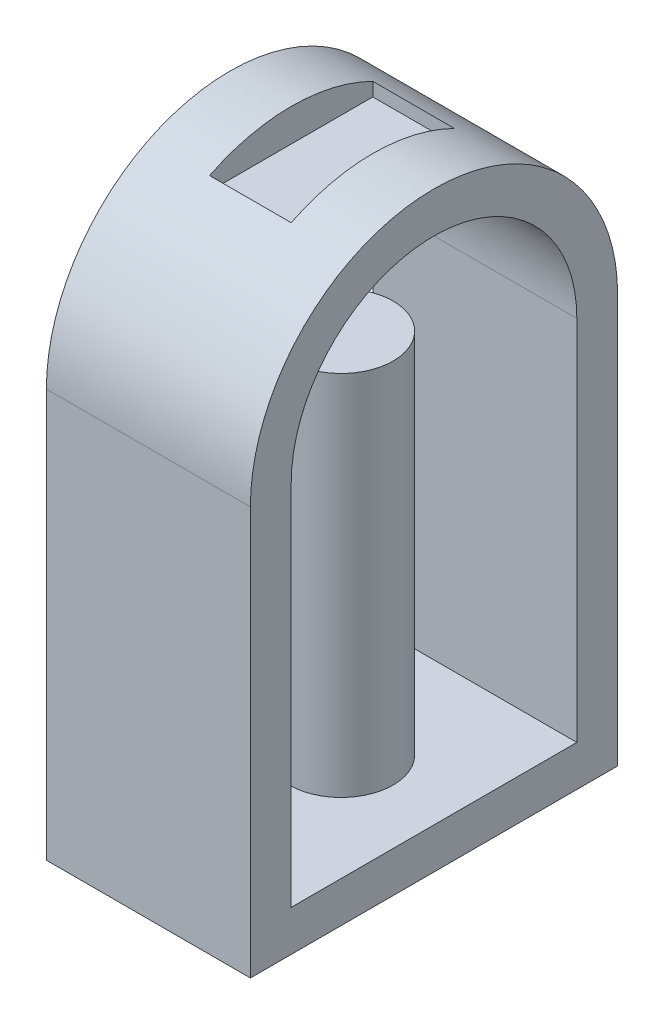
ISO-10303-21;
HEADER;
FILE_DESCRIPTION(('STEP AP214'),'2;1');
FILE_NAME('part.step','',(''),(''),'','','');
FILE_SCHEMA(('AUTOMOTIVE_DESIGN { 1 0 10303 214 1 1 1 1 }'));
ENDSEC;
DATA;
#1=APPLICATION_CONTEXT('core data for automotive mechanical design processes');
#2=APPLICATION_PROTOCOL_DEFINITION('international standard','automotive_design',2000,#1);
#3=PRODUCT_CONTEXT('',#1,'mechanical');
#4=PRODUCT('Part','Part','',(#3));
#5=PRODUCT_RELATED_PRODUCT_CATEGORY('part','',(#4));
#6=PRODUCT_DEFINITION_FORMATION('','',#4);
#7=PRODUCT_DEFINITION_CONTEXT('part definition',#1,'design');
#8=PRODUCT_DEFINITION('design','',#6,#7);
#9=PRODUCT_DEFINITION_SHAPE('','',#8);
#10=(LENGTH_UNIT() NAMED_UNIT(*) SI_UNIT(.MILLI.,.METRE.));
#11=(NAMED_UNIT(*) PLANE_ANGLE_UNIT() SI_UNIT($,.RADIAN.));
#12=(NAMED_UNIT(*) SI_UNIT($,.STERADIAN.) SOLID_ANGLE_UNIT());
#13=UNCERTAINTY_MEASURE_WITH_UNIT(LENGTH_MEASURE(1.E-05),#10,'distance_accuracy_value','');
#14=(GEOMETRIC_REPRESENTATION_CONTEXT(3) GLOBAL_UNCERTAINTY_ASSIGNED_CONTEXT((#13)) GLOBAL_UNIT_ASSIGNED_CONTEXT((#10,
#11,#12)) REPRESENTATION_CONTEXT('',''));
#15=CARTESIAN_POINT('',(0.,0.,0.));
#16=DIRECTION('',(0.,0.,1.));
#17=DIRECTION('',(1.,0.,0.));
#18=AXIS2_PLACEMENT_3D('',#15,#16,#17);
#19=CARTESIAN_POINT('',(127.,228.6,-88.8999999999999));
#20=DIRECTION('',(-1.,0.,0.));
#21=DIRECTION('',(0.,0.,1.));
#22=AXIS2_PLACEMENT_3D('',#19,#20,#21);
#23=PLANE('',#22);
#24=DIRECTION('',(0.,0.,-1.));
#25=VECTOR('',#24,1.);
#26=CARTESIAN_POINT('',(127.,-25.4,25.4));
#27=LINE('',#26,#25);
#28=CARTESIAN_POINT('',(127.,-25.4,25.4));
#29=VERTEX_POINT('',#28);
#30=CARTESIAN_POINT('',(127.,-25.4,-203.2));
#31=VERTEX_POINT('',#30);
#32=EDGE_CURVE('E198',#29,#31,#27,.T.);
#33=ORIENTED_EDGE('',*,*,#32,.T.);
#34=DIRECTION('',(0.,1.,0.));
#35=VECTOR('',#34,1.);
#36=CARTESIAN_POINT('',(127.,-25.4,-203.2));
#37=LINE('',#36,#35);
#38=CARTESIAN_POINT('',(127.,228.6,-203.2));
#39=VERTEX_POINT('',#38);
#40=EDGE_CURVE('E201',#31,#39,#37,.T.);
#41=ORIENTED_EDGE('',*,*,#40,.T.);
#42=CARTESIAN_POINT('',(127.,228.6,-88.8999999999999));
#43=DIRECTION('',(1.,0.,0.));
#44=DIRECTION('',(0.,0.,1.));
#45=AXIS2_PLACEMENT_3D('',#42,#43,#44);
#46=CIRCLE('',#45,114.3);
#47=CARTESIAN_POINT('',(127.,228.6,25.4));
#48=VERTEX_POINT('',#47);
#49=EDGE_CURVE('E204',#39,#48,#46,.T.);
#50=ORIENTED_EDGE('',*,*,#49,.T.);
#51=DIRECTION('',(0.,-1.,0.));
#52=VECTOR('',#51,1.);
#53=CARTESIAN_POINT('',(127.,-25.4,25.4));
#54=LINE('',#53,#52);
#55=EDGE_CURVE('E206',#48,#29,#54,.T.);
#56=ORIENTED_EDGE('',*,*,#55,.T.);
#57=EDGE_LOOP('',(#33,#41,#50,#56));
#58=FACE_BOUND('',#57,.T.);
#59=DIRECTION('',(0.,-1.,0.));
#60=VECTOR('',#59,1.);
#61=CARTESIAN_POINT('',(127.,0.,0.));
#62=LINE('',#61,#60);
#63=CARTESIAN_POINT('',(127.,228.6,0.));
#64=VERTEX_POINT('',#63);
#65=CARTESIAN_POINT('',(127.,0.,0.));
#66=VERTEX_POINT('',#65);
#67=EDGE_CURVE('E169',#64,#66,#62,.T.);
#68=ORIENTED_EDGE('',*,*,#67,.F.);
#69=CARTESIAN_POINT('',(127.,228.6,-88.8999999999999));
#70=DIRECTION('',(1.,0.,0.));
#71=DIRECTION('',(0.,0.,1.));
#72=AXIS2_PLACEMENT_3D('',#69,#70,#71);
#73=CIRCLE('',#72,88.9);
#74=CARTESIAN_POINT('',(127.,228.6,-177.8));
#75=VERTEX_POINT('',#74);
#76=EDGE_CURVE('E176',#75,#64,#73,.T.);
#77=ORIENTED_EDGE('',*,*,#76,.F.);
#78=DIRECTION('',(0.,1.,0.));
#79=VECTOR('',#78,1.);
#80=CARTESIAN_POINT('',(127.,0.,-177.8));
#81=LINE('',#80,#79);
#82=CARTESIAN_POINT('',(127.,0.,-177.8));
#83=VERTEX_POINT('',#82);
#84=EDGE_CURVE('E174',#83,#75,#81,.T.);
#85=ORIENTED_EDGE('',*,*,#84,.F.);
#86=DIRECTION('',(0.,0.,-1.));
#87=VECTOR('',#86,1.);
#88=CARTESIAN_POINT('',(127.,0.,0.));
#89=LINE('',#88,#87);
#90=EDGE_CURVE('E171',#66,#83,#89,.T.);
#91=ORIENTED_EDGE('',*,*,#90,.F.);
#92=EDGE_LOOP('',(#68,#77,#85,#91));
#93=FACE_BOUND('',#92,.T.);
#94=ADVANCED_FACE('F45',(#58,#93),#23,.F.);
#95=CARTESIAN_POINT('',(0.,228.6,-88.8999999999999));
#96=DIRECTION('',(-1.,0.,0.));
#97=DIRECTION('',(0.,0.,1.));
#98=AXIS2_PLACEMENT_3D('',#95,#96,#97);
#99=PLANE('',#98);
#100=DIRECTION('',(0.,0.,-1.));
#101=VECTOR('',#100,1.);
#102=CARTESIAN_POINT('',(0.,-25.4,25.4));
#103=LINE('',#102,#101);
#104=CARTESIAN_POINT('',(0.,-25.4,25.4));
#105=VERTEX_POINT('',#104);
#106=CARTESIAN_POINT('',(0.,-25.4,-203.2));
#107=VERTEX_POINT('',#106);
#108=EDGE_CURVE('E197',#105,#107,#103,.T.);
#109=ORIENTED_EDGE('',*,*,#108,.F.);
#110=DIRECTION('',(0.,-1.,0.));
#111=VECTOR('',#110,1.);
#112=CARTESIAN_POINT('',(0.,-25.4,25.4));
#113=LINE('',#112,#111);
#114=CARTESIAN_POINT('',(0.,228.6,25.4));
#115=VERTEX_POINT('',#114);
#116=EDGE_CURVE('E202',#115,#105,#113,.T.);
#117=ORIENTED_EDGE('',*,*,#116,.F.);
#118=CARTESIAN_POINT('',(0.,228.6,-88.8999999999999));
#119=DIRECTION('',(1.,0.,0.));
#120=DIRECTION('',(0.,0.,1.));
#121=AXIS2_PLACEMENT_3D('',#118,#119,#120);
#122=CIRCLE('',#121,114.3);
#123=CARTESIAN_POINT('',(0.,228.6,-203.2));
#124=VERTEX_POINT('',#123);
#125=EDGE_CURVE('E213',#124,#115,#122,.T.);
#126=ORIENTED_EDGE('',*,*,#125,.F.);
#127=DIRECTION('',(0.,1.,0.));
#128=VECTOR('',#127,1.);
#129=CARTESIAN_POINT('',(0.,-25.4,-203.2));
#130=LINE('',#129,#128);
#131=EDGE_CURVE('E211',#107,#124,#130,.T.);
#132=ORIENTED_EDGE('',*,*,#131,.F.);
#133=EDGE_LOOP('',(#109,#117,#126,#132));
#134=FACE_BOUND('',#133,.T.);
#135=CARTESIAN_POINT('',(0.,228.6,-88.8999999999999));
#136=DIRECTION('',(1.,0.,0.));
#137=DIRECTION('',(0.,0.,1.));
#138=AXIS2_PLACEMENT_3D('',#135,#136,#137);
#139=CIRCLE('',#138,88.9);
#140=CARTESIAN_POINT('',(0.,228.6,-177.8));
#141=VERTEX_POINT('',#140);
#142=CARTESIAN_POINT('',(0.,228.6,0.));
#143=VERTEX_POINT('',#142);
#144=EDGE_CURVE('E172',#141,#143,#139,.T.);
#145=ORIENTED_EDGE('',*,*,#144,.T.);
#146=DIRECTION('',(0.,-1.,0.));
#147=VECTOR('',#146,1.);
#148=CARTESIAN_POINT('',(0.,0.,0.));
#149=LINE('',#148,#147);
#150=CARTESIAN_POINT('',(0.,0.,0.));
#151=VERTEX_POINT('',#150);
#152=EDGE_CURVE('E164',#143,#151,#149,.T.);
#153=ORIENTED_EDGE('',*,*,#152,.T.);
#154=DIRECTION('',(0.,0.,-1.));
#155=VECTOR('',#154,1.);
#156=CARTESIAN_POINT('',(0.,0.,0.));
#157=LINE('',#156,#155);
#158=CARTESIAN_POINT('',(0.,0.,-177.8));
#159=VERTEX_POINT('',#158);
#160=EDGE_CURVE('E181',#151,#159,#157,.T.);
#161=ORIENTED_EDGE('',*,*,#160,.T.);
#162=DIRECTION('',(0.,1.,0.));
#163=VECTOR('',#162,1.);
#164=CARTESIAN_POINT('',(0.,0.,-177.8));
#165=LINE('',#164,#163);
#166=EDGE_CURVE('E184',#159,#141,#165,.T.);
#167=ORIENTED_EDGE('',*,*,#166,.T.);
#168=EDGE_LOOP('',(#145,#153,#161,#167));
#169=FACE_BOUND('',#168,.T.);
#170=ADVANCED_FACE('F249',(#134,#169),#99,.T.);
#171=CARTESIAN_POINT('',(127.,-25.4,25.4));
#172=DIRECTION('',(0.,1.,0.));
#173=DIRECTION('',(0.,0.,1.));
#174=AXIS2_PLACEMENT_3D('',#171,#172,#173);
#175=PLANE('',#174);
#176=ORIENTED_EDGE('',*,*,#108,.T.);
#177=DIRECTION('',(-1.,0.,0.));
#178=VECTOR('',#177,1.);
#179=CARTESIAN_POINT('',(127.,-25.4,-203.2));
#180=LINE('',#179,#178);
#181=EDGE_CURVE('E224',#31,#107,#180,.T.);
#182=ORIENTED_EDGE('',*,*,#181,.F.);
#183=ORIENTED_EDGE('',*,*,#32,.F.);
#184=DIRECTION('',(-1.,0.,0.));
#185=VECTOR('',#184,1.);
#186=CARTESIAN_POINT('',(127.,-25.4,25.4));
#187=LINE('',#186,#185);
#188=EDGE_CURVE('E208',#29,#105,#187,.T.);
#189=ORIENTED_EDGE('',*,*,#188,.T.);
#190=EDGE_LOOP('',(#176,#182,#183,#189));
#191=FACE_BOUND('',#190,.T.);
#192=ADVANCED_FACE('F47',(#191),#175,.F.);
#193=CARTESIAN_POINT('',(127.,-25.4,-203.2));
#194=DIRECTION('',(0.,0.,1.));
#195=DIRECTION('',(0.,-1.,0.));
#196=AXIS2_PLACEMENT_3D('',#193,#194,#195);
#197=PLANE('',#196);
#198=ORIENTED_EDGE('',*,*,#131,.T.);
#199=DIRECTION('',(-1.,0.,0.));
#200=VECTOR('',#199,1.);
#201=CARTESIAN_POINT('',(127.,228.6,-203.2));
#202=LINE('',#201,#200);
#203=EDGE_CURVE('E221',#39,#124,#202,.T.);
#204=ORIENTED_EDGE('',*,*,#203,.F.);
#205=ORIENTED_EDGE('',*,*,#40,.F.);
#206=ORIENTED_EDGE('',*,*,#181,.T.);
#207=EDGE_LOOP('',(#198,#204,#205,#206));
#208=FACE_BOUND('',#207,.T.);
#209=ADVANCED_FACE('F267',(#208),#197,.F.);
#210=CARTESIAN_POINT('',(127.,228.6,-88.8999999999999));
#211=DIRECTION('',(-1.,0.,0.));
#212=DIRECTION('',(0.,0.,1.));
#213=AXIS2_PLACEMENT_3D('',#210,#211,#212);
#214=CYLINDRICAL_SURFACE('',#213,114.3);
#215=DIRECTION('',(-1.,0.,0.));
#216=VECTOR('',#215,1.);
#217=CARTESIAN_POINT('',(127.,330.990673403392,-139.7));
#218=LINE('',#217,#216);
#219=CARTESIAN_POINT('',(38.1,330.990673403392,-139.7));
#220=VERTEX_POINT('',#219);
#221=CARTESIAN_POINT('',(88.9,330.990673403392,-139.7));
#222=VERTEX_POINT('',#221);
#223=EDGE_CURVE('E53',#220,#222,#218,.F.);
#224=ORIENTED_EDGE('',*,*,#223,.T.);
#225=CARTESIAN_POINT('',(88.9,228.6,-88.8999999999999));
#226=DIRECTION('',(1.,0.,0.));
#227=DIRECTION('',(0.,0.,-1.));
#228=AXIS2_PLACEMENT_3D('',#225,#226,#227);
#229=CIRCLE('',#228,114.3);
#230=CARTESIAN_POINT('',(88.9,330.990673403392,-38.1));
#231=VERTEX_POINT('',#230);
#232=EDGE_CURVE('E227',#222,#231,#229,.T.);
#233=ORIENTED_EDGE('',*,*,#232,.T.);
#234=DIRECTION('',(-1.,0.,0.));
#235=VECTOR('',#234,1.);
#236=CARTESIAN_POINT('',(127.,330.990673403392,-38.1));
#237=LINE('',#236,#235);
#238=CARTESIAN_POINT('',(38.1,330.990673403392,-38.1));
#239=VERTEX_POINT('',#238);
#240=EDGE_CURVE('E231',#231,#239,#237,.T.);
#241=ORIENTED_EDGE('',*,*,#240,.T.);
#242=CARTESIAN_POINT('',(38.1,228.6,-88.8999999999999));
#243=DIRECTION('',(-1.,0.,0.));
#244=DIRECTION('',(0.,0.,1.));
#245=AXIS2_PLACEMENT_3D('',#242,#243,#244);
#246=CIRCLE('',#245,114.3);
#247=EDGE_CURVE('E60',#239,#220,#246,.T.);
#248=ORIENTED_EDGE('',*,*,#247,.T.);
#249=EDGE_LOOP('',(#224,#233,#241,#248));
#250=FACE_BOUND('',#249,.T.);
#251=ORIENTED_EDGE('',*,*,#125,.T.);
#252=DIRECTION('',(-1.,0.,0.));
#253=VECTOR('',#252,1.);
#254=CARTESIAN_POINT('',(127.,228.6,25.4));
#255=LINE('',#254,#253);
#256=EDGE_CURVE('E218',#48,#115,#255,.T.);
#257=ORIENTED_EDGE('',*,*,#256,.F.);
#258=ORIENTED_EDGE('',*,*,#49,.F.);
#259=ORIENTED_EDGE('',*,*,#203,.T.);
#260=EDGE_LOOP('',(#251,#257,#258,#259));
#261=FACE_BOUND('',#260,.T.);
#262=ADVANCED_FACE('F234',(#250,#261),#214,.T.);
#263=CARTESIAN_POINT('',(127.,-25.4,25.4));
#264=DIRECTION('',(0.,0.,-1.));
#265=DIRECTION('',(-1.,0.,0.));
#266=AXIS2_PLACEMENT_3D('',#263,#264,#265);
#267=PLANE('',#266);
#268=ORIENTED_EDGE('',*,*,#116,.T.);
#269=ORIENTED_EDGE('',*,*,#188,.F.);
#270=ORIENTED_EDGE('',*,*,#55,.F.);
#271=ORIENTED_EDGE('',*,*,#256,.T.);
#272=EDGE_LOOP('',(#268,#269,#270,#271));
#273=FACE_BOUND('',#272,.T.);
#274=ADVANCED_FACE('F262',(#273),#267,.F.);
#275=CARTESIAN_POINT('',(127.,0.,0.));
#276=DIRECTION('',(0.,0.,-1.));
#277=DIRECTION('',(0.,1.,0.));
#278=AXIS2_PLACEMENT_3D('',#275,#276,#277);
#279=PLANE('',#278);
#280=ORIENTED_EDGE('',*,*,#152,.F.);
#281=DIRECTION('',(-1.,0.,0.));
#282=VECTOR('',#281,1.);
#283=CARTESIAN_POINT('',(127.,228.6,0.));
#284=LINE('',#283,#282);
#285=EDGE_CURVE('E178',#64,#143,#284,.T.);
#286=ORIENTED_EDGE('',*,*,#285,.F.);
#287=ORIENTED_EDGE('',*,*,#67,.T.);
#288=DIRECTION('',(-1.,0.,0.));
#289=VECTOR('',#288,1.);
#290=CARTESIAN_POINT('',(127.,0.,0.));
#291=LINE('',#290,#289);
#292=EDGE_CURVE('E194',#66,#151,#291,.T.);
#293=ORIENTED_EDGE('',*,*,#292,.T.);
#294=EDGE_LOOP('',(#280,#286,#287,#293));
#295=FACE_BOUND('',#294,.T.);
#296=ADVANCED_FACE('F259',(#295),#279,.T.);
#297=CARTESIAN_POINT('',(127.,0.,0.));
#298=DIRECTION('',(0.,1.,0.));
#299=DIRECTION('',(0.,0.,1.));
#300=AXIS2_PLACEMENT_3D('',#297,#298,#299);
#301=PLANE('',#300);
#302=CARTESIAN_POINT('',(60.4712954458477,0.,-97.629795479616));
#303=DIRECTION('',(0.,1.,0.));
#304=DIRECTION('',(0.,0.,1.));
#305=AXIS2_PLACEMENT_3D('',#302,#303,#304);
#306=CIRCLE('',#305,32.3622446470558);
#307=CARTESIAN_POINT('',(60.4712954458477,0.,-65.2675508325602));
#308=VERTEX_POINT('',#307);
#309=EDGE_CURVE('E11',#308,#308,#306,.T.);
#310=ORIENTED_EDGE('',*,*,#309,.F.);
#311=EDGE_LOOP('',(#310));
#312=FACE_BOUND('',#311,.T.);
#313=ORIENTED_EDGE('',*,*,#160,.F.);
#314=ORIENTED_EDGE('',*,*,#292,.F.);
#315=ORIENTED_EDGE('',*,*,#90,.T.);
#316=DIRECTION('',(-1.,0.,0.));
#317=VECTOR('',#316,1.);
#318=CARTESIAN_POINT('',(127.,0.,-177.8));
#319=LINE('',#318,#317);
#320=EDGE_CURVE('E192',#83,#159,#319,.T.);
#321=ORIENTED_EDGE('',*,*,#320,.T.);
#322=EDGE_LOOP('',(#313,#314,#315,#321));
#323=FACE_BOUND('',#322,.T.);
#324=ADVANCED_FACE('F296',(#312,#323),#301,.T.);
#325=CARTESIAN_POINT('',(127.,0.,-177.8));
#326=DIRECTION('',(0.,0.,1.));
#327=DIRECTION('',(1.,0.,0.));
#328=AXIS2_PLACEMENT_3D('',#325,#326,#327);
#329=PLANE('',#328);
#330=ORIENTED_EDGE('',*,*,#166,.F.);
#331=ORIENTED_EDGE('',*,*,#320,.F.);
#332=ORIENTED_EDGE('',*,*,#84,.T.);
#333=DIRECTION('',(-1.,0.,0.));
#334=VECTOR('',#333,1.);
#335=CARTESIAN_POINT('',(127.,228.6,-177.8));
#336=LINE('',#335,#334);
#337=EDGE_CURVE('E68',#75,#141,#336,.T.);
#338=ORIENTED_EDGE('',*,*,#337,.T.);
#339=EDGE_LOOP('',(#330,#331,#332,#338));
#340=FACE_BOUND('',#339,.T.);
#341=ADVANCED_FACE('F298',(#340),#329,.T.);
#342=CARTESIAN_POINT('',(127.,228.6,-88.8999999999999));
#343=DIRECTION('',(-1.,0.,0.));
#344=DIRECTION('',(0.,0.,1.));
#345=AXIS2_PLACEMENT_3D('',#342,#343,#344);
#346=CYLINDRICAL_SURFACE('',#345,88.9);
#347=ORIENTED_EDGE('',*,*,#144,.F.);
#348=ORIENTED_EDGE('',*,*,#337,.F.);
#349=ORIENTED_EDGE('',*,*,#76,.T.);
#350=ORIENTED_EDGE('',*,*,#285,.T.);
#351=EDGE_LOOP('',(#347,#348,#349,#350));
#352=FACE_BOUND('',#351,.T.);
#353=ADVANCED_FACE('F286',(#352),#346,.F.);
#354=CARTESIAN_POINT('',(38.1,322.58,-38.1));
#355=DIRECTION('',(-1.,0.,0.));
#356=DIRECTION('',(0.,0.,1.));
#357=AXIS2_PLACEMENT_3D('',#354,#355,#356);
#358=PLANE('',#357);
#359=DIRECTION('',(0.,1.,0.));
#360=VECTOR('',#359,1.);
#361=CARTESIAN_POINT('',(38.1,322.58,-38.1));
#362=LINE('',#361,#360);
#363=CARTESIAN_POINT('',(38.1,322.58,-38.1));
#364=VERTEX_POINT('',#363);
#365=EDGE_CURVE('E133',#364,#239,#362,.T.);
#366=ORIENTED_EDGE('',*,*,#365,.F.);
#367=DIRECTION('',(0.,0.,1.));
#368=VECTOR('',#367,1.);
#369=CARTESIAN_POINT('',(38.1,322.58,-38.1));
#370=LINE('',#369,#368);
#371=CARTESIAN_POINT('',(38.1,322.58,-139.7));
#372=VERTEX_POINT('',#371);
#373=EDGE_CURVE('E137',#372,#364,#370,.T.);
#374=ORIENTED_EDGE('',*,*,#373,.F.);
#375=DIRECTION('',(0.,1.,0.));
#376=VECTOR('',#375,1.);
#377=CARTESIAN_POINT('',(38.1,322.58,-139.7));
#378=LINE('',#377,#376);
#379=EDGE_CURVE('E162',#372,#220,#378,.T.);
#380=ORIENTED_EDGE('',*,*,#379,.T.);
#381=ORIENTED_EDGE('',*,*,#247,.F.);
#382=EDGE_LOOP('',(#366,#374,#380,#381));
#383=FACE_BOUND('',#382,.T.);
#384=ADVANCED_FACE('F135',(#383),#358,.F.);
#385=CARTESIAN_POINT('',(38.1,322.58,-139.7));
#386=DIRECTION('',(0.,0.,-1.));
#387=DIRECTION('',(-1.,0.,0.));
#388=AXIS2_PLACEMENT_3D('',#385,#386,#387);
#389=PLANE('',#388);
#390=ORIENTED_EDGE('',*,*,#379,.F.);
#391=DIRECTION('',(-1.,0.,0.));
#392=VECTOR('',#391,1.);
#393=CARTESIAN_POINT('',(38.1,322.58,-139.7));
#394=LINE('',#393,#392);
#395=CARTESIAN_POINT('',(88.9,322.58,-139.7));
#396=VERTEX_POINT('',#395);
#397=EDGE_CURVE('E142',#396,#372,#394,.T.);
#398=ORIENTED_EDGE('',*,*,#397,.F.);
#399=DIRECTION('',(0.,1.,0.));
#400=VECTOR('',#399,1.);
#401=CARTESIAN_POINT('',(88.9,322.58,-139.7));
#402=LINE('',#401,#400);
#403=EDGE_CURVE('E165',#396,#222,#402,.T.);
#404=ORIENTED_EDGE('',*,*,#403,.T.);
#405=ORIENTED_EDGE('',*,*,#223,.F.);
#406=EDGE_LOOP('',(#390,#398,#404,#405));
#407=FACE_BOUND('',#406,.T.);
#408=ADVANCED_FACE('F237',(#407),#389,.F.);
#409=CARTESIAN_POINT('',(88.9,322.58,-38.1));
#410=DIRECTION('',(1.,0.,0.));
#411=DIRECTION('',(0.,0.,-1.));
#412=AXIS2_PLACEMENT_3D('',#409,#410,#411);
#413=PLANE('',#412);
#414=ORIENTED_EDGE('',*,*,#403,.F.);
#415=DIRECTION('',(0.,0.,-1.));
#416=VECTOR('',#415,1.);
#417=CARTESIAN_POINT('',(88.9,322.58,-38.1));
#418=LINE('',#417,#416);
#419=CARTESIAN_POINT('',(88.9,322.58,-38.1));
#420=VERTEX_POINT('',#419);
#421=EDGE_CURVE('E151',#420,#396,#418,.T.);
#422=ORIENTED_EDGE('',*,*,#421,.F.);
#423=DIRECTION('',(0.,1.,0.));
#424=VECTOR('',#423,1.);
#425=CARTESIAN_POINT('',(88.9,322.58,-38.1));
#426=LINE('',#425,#424);
#427=EDGE_CURVE('E141',#420,#231,#426,.T.);
#428=ORIENTED_EDGE('',*,*,#427,.T.);
#429=ORIENTED_EDGE('',*,*,#232,.F.);
#430=EDGE_LOOP('',(#414,#422,#428,#429));
#431=FACE_BOUND('',#430,.T.);
#432=ADVANCED_FACE('F239',(#431),#413,.F.);
#433=CARTESIAN_POINT('',(38.1,322.58,-38.1));
#434=DIRECTION('',(0.,0.,1.));
#435=DIRECTION('',(1.,0.,0.));
#436=AXIS2_PLACEMENT_3D('',#433,#434,#435);
#437=PLANE('',#436);
#438=ORIENTED_EDGE('',*,*,#427,.F.);
#439=DIRECTION('',(1.,0.,0.));
#440=VECTOR('',#439,1.);
#441=CARTESIAN_POINT('',(38.1,322.58,-38.1));
#442=LINE('',#441,#440);
#443=EDGE_CURVE('E145',#364,#420,#442,.T.);
#444=ORIENTED_EDGE('',*,*,#443,.F.);
#445=ORIENTED_EDGE('',*,*,#365,.T.);
#446=ORIENTED_EDGE('',*,*,#240,.F.);
#447=EDGE_LOOP('',(#438,#444,#445,#446));
#448=FACE_BOUND('',#447,.T.);
#449=ADVANCED_FACE('F146',(#448),#437,.F.);
#450=CARTESIAN_POINT('',(0.,322.58,0.));
#451=DIRECTION('',(0.,-1.,0.));
#452=DIRECTION('',(0.,0.,-1.));
#453=AXIS2_PLACEMENT_3D('',#450,#451,#452);
#454=PLANE('',#453);
#455=ORIENTED_EDGE('',*,*,#373,.T.);
#456=ORIENTED_EDGE('',*,*,#443,.T.);
#457=ORIENTED_EDGE('',*,*,#421,.T.);
#458=ORIENTED_EDGE('',*,*,#397,.T.);
#459=EDGE_LOOP('',(#455,#456,#457,#458));
#460=FACE_BOUND('',#459,.T.);
#461=ADVANCED_FACE('F153',(#460),#454,.F.);
#462=CARTESIAN_POINT('',(60.4712954458477,228.6,-97.629795479616));
#463=DIRECTION('',(0.,1.,0.));
#464=DIRECTION('',(0.,0.,1.));
#465=AXIS2_PLACEMENT_3D('',#462,#463,#464);
#466=PLANE('',#465);
#467=CARTESIAN_POINT('',(60.4712954458477,228.6,-97.629795479616));
#468=DIRECTION('',(0.,1.,0.));
#469=DIRECTION('',(0.,0.,1.));
#470=AXIS2_PLACEMENT_3D('',#467,#468,#469);
#471=CIRCLE('',#470,32.3622446470558);
#472=CARTESIAN_POINT('',(60.4712954458477,228.6,-65.2675508325602));
#473=VERTEX_POINT('',#472);
#474=EDGE_CURVE('E155',#473,#473,#471,.T.);
#475=ORIENTED_EDGE('',*,*,#474,.T.);
#476=EDGE_LOOP('',(#475));
#477=FACE_BOUND('',#476,.T.);
#478=ADVANCED_FACE('F340',(#477),#466,.T.);
#479=CARTESIAN_POINT('',(60.4712954458477,-25.402,-97.629795479616));
#480=DIRECTION('',(0.,1.,0.));
#481=DIRECTION('',(0.,0.,1.));
#482=AXIS2_PLACEMENT_3D('',#479,#480,#481);
#483=CYLINDRICAL_SURFACE('',#482,32.3622446470558);
#484=ORIENTED_EDGE('',*,*,#309,.T.);
#485=EDGE_LOOP('',(#484));
#486=FACE_BOUND('',#485,.T.);
#487=ORIENTED_EDGE('',*,*,#474,.F.);
#488=EDGE_LOOP('',(#487));
#489=FACE_BOUND('',#488,.T.);
#490=ADVANCED_FACE('F342',(#486,#489),#483,.T.);
#491=CLOSED_SHELL('',(#94,#170,#192,#209,#262,#274,#296,#324,#341,#353,#384,#408,#432,#449,#461,
#478,#490));
#492=MANIFOLD_SOLID_BREP('B2',#491);
#493=ADVANCED_BREP_SHAPE_REPRESENTATION('',(#18,#492),#14);
#494=SHAPE_DEFINITION_REPRESENTATION(#9,#493);
ENDSEC;
END-ISO-10303-21;
